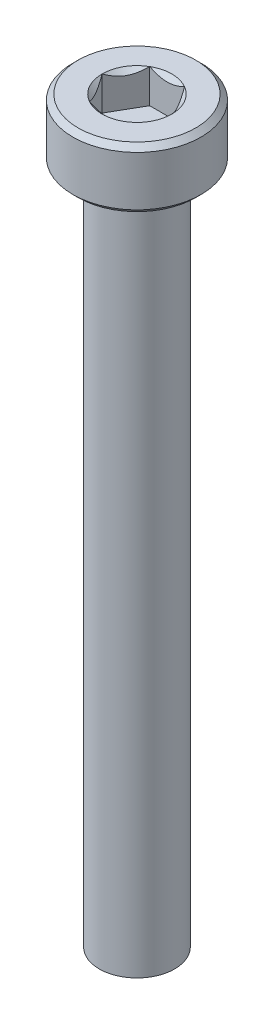
ISO-10303-21;
HEADER;
FILE_DESCRIPTION(('STEP AP214'),'2;1');
FILE_NAME('part.step','',(''),(''),'','','');
FILE_SCHEMA(('AUTOMOTIVE_DESIGN { 1 0 10303 214 1 1 1 1 }'));
ENDSEC;
DATA;
#1=APPLICATION_CONTEXT('core data for automotive mechanical design processes');
#2=APPLICATION_PROTOCOL_DEFINITION('international standard','automotive_design',2000,#1);
#3=PRODUCT_CONTEXT('',#1,'mechanical');
#4=PRODUCT('Part','Part','',(#3));
#5=PRODUCT_RELATED_PRODUCT_CATEGORY('part','',(#4));
#6=PRODUCT_DEFINITION_FORMATION('','',#4);
#7=PRODUCT_DEFINITION_CONTEXT('part definition',#1,'design');
#8=PRODUCT_DEFINITION('design','',#6,#7);
#9=PRODUCT_DEFINITION_SHAPE('','',#8);
#10=(LENGTH_UNIT() NAMED_UNIT(*) SI_UNIT(.MILLI.,.METRE.));
#11=(NAMED_UNIT(*) PLANE_ANGLE_UNIT() SI_UNIT($,.RADIAN.));
#12=(NAMED_UNIT(*) SI_UNIT($,.STERADIAN.) SOLID_ANGLE_UNIT());
#13=UNCERTAINTY_MEASURE_WITH_UNIT(LENGTH_MEASURE(1.E-05),#10,'distance_accuracy_value','');
#14=(GEOMETRIC_REPRESENTATION_CONTEXT(3) GLOBAL_UNCERTAINTY_ASSIGNED_CONTEXT((#13)) GLOBAL_UNIT_ASSIGNED_CONTEXT((#10,
#11,#12)) REPRESENTATION_CONTEXT('',''));
#15=CARTESIAN_POINT('',(0.,0.,0.));
#16=DIRECTION('',(0.,0.,1.));
#17=DIRECTION('',(1.,0.,0.));
#18=AXIS2_PLACEMENT_3D('',#15,#16,#17);
#19=CARTESIAN_POINT('',(0.,4.,0.));
#20=DIRECTION('',(0.,-1.,0.));
#21=DIRECTION('',(0.,0.,-1.));
#22=AXIS2_PLACEMENT_3D('',#19,#20,#21);
#23=CYLINDRICAL_SURFACE('',#22,4.25);
#24=CARTESIAN_POINT('',(0.,0.35,0.));
#25=DIRECTION('',(0.,1.,0.));
#26=DIRECTION('',(0.,0.,1.));
#27=AXIS2_PLACEMENT_3D('',#24,#25,#26);
#28=CIRCLE('',#27,4.25);
#29=CARTESIAN_POINT('',(0.,0.35,4.25));
#30=VERTEX_POINT('',#29);
#31=EDGE_CURVE('E191',#30,#30,#28,.T.);
#32=ORIENTED_EDGE('',*,*,#31,.T.);
#33=EDGE_LOOP('',(#32));
#34=FACE_BOUND('',#33,.T.);
#35=CARTESIAN_POINT('',(0.,3.65,0.));
#36=DIRECTION('',(0.,1.,0.));
#37=DIRECTION('',(0.,0.,1.));
#38=AXIS2_PLACEMENT_3D('',#35,#36,#37);
#39=CIRCLE('',#38,4.25);
#40=CARTESIAN_POINT('',(0.,3.65,4.25));
#41=VERTEX_POINT('',#40);
#42=EDGE_CURVE('E172',#41,#41,#39,.F.);
#43=ORIENTED_EDGE('',*,*,#42,.T.);
#44=EDGE_LOOP('',(#43));
#45=FACE_BOUND('',#44,.T.);
#46=ADVANCED_FACE('F33',(#34,#45),#23,.T.);
#47=CARTESIAN_POINT('',(0.,4.,0.));
#48=DIRECTION('',(0.,1.,0.));
#49=DIRECTION('',(0.,0.,1.));
#50=AXIS2_PLACEMENT_3D('',#47,#48,#49);
#51=PLANE('',#50);
#52=CARTESIAN_POINT('',(0.,4.,0.));
#53=DIRECTION('',(0.,1.,0.));
#54=DIRECTION('',(0.,0.,1.));
#55=AXIS2_PLACEMENT_3D('',#52,#53,#54);
#56=CIRCLE('',#55,3.9);
#57=CARTESIAN_POINT('',(0.,4.,3.9));
#58=VERTEX_POINT('',#57);
#59=EDGE_CURVE('E37',#58,#58,#56,.T.);
#60=ORIENTED_EDGE('',*,*,#59,.T.);
#61=EDGE_LOOP('',(#60));
#62=FACE_BOUND('',#61,.T.);
#63=CARTESIAN_POINT('',(0.,4.,0.));
#64=DIRECTION('',(0.,1.,0.));
#65=DIRECTION('',(0.,0.,1.));
#66=AXIS2_PLACEMENT_3D('',#63,#64,#65);
#67=CIRCLE('',#66,2.3094010767585);
#68=CARTESIAN_POINT('',(1.15470053837925,4.,2.));
#69=VERTEX_POINT('',#68);
#70=CARTESIAN_POINT('',(2.3094010767585,4.,0.));
#71=VERTEX_POINT('',#70);
#72=EDGE_CURVE('E48',#69,#71,#67,.T.);
#73=ORIENTED_EDGE('',*,*,#72,.F.);
#74=CARTESIAN_POINT('',(-1.15470053837925,4.,2.));
#75=VERTEX_POINT('',#74);
#76=EDGE_CURVE('E55',#75,#69,#67,.T.);
#77=ORIENTED_EDGE('',*,*,#76,.F.);
#78=CARTESIAN_POINT('',(-2.3094010767585,4.,0.));
#79=VERTEX_POINT('',#78);
#80=EDGE_CURVE('E220',#79,#75,#67,.T.);
#81=ORIENTED_EDGE('',*,*,#80,.F.);
#82=CARTESIAN_POINT('',(-1.15470053837925,4.,-2.));
#83=VERTEX_POINT('',#82);
#84=EDGE_CURVE('E270',#83,#79,#67,.T.);
#85=ORIENTED_EDGE('',*,*,#84,.F.);
#86=CARTESIAN_POINT('',(1.15470053837925,4.,-2.));
#87=VERTEX_POINT('',#86);
#88=EDGE_CURVE('E274',#87,#83,#67,.T.);
#89=ORIENTED_EDGE('',*,*,#88,.F.);
#90=EDGE_CURVE('E223',#71,#87,#67,.T.);
#91=ORIENTED_EDGE('',*,*,#90,.F.);
#92=EDGE_LOOP('',(#73,#77,#81,#85,#89,#91));
#93=FACE_BOUND('',#92,.T.);
#94=ADVANCED_FACE('F118',(#62,#93),#51,.T.);
#95=CARTESIAN_POINT('',(0.,0.,0.));
#96=DIRECTION('',(0.,1.,0.));
#97=DIRECTION('',(0.,0.,1.));
#98=AXIS2_PLACEMENT_3D('',#95,#96,#97);
#99=PLANE('',#98);
#100=CARTESIAN_POINT('',(0.,0.,0.));
#101=DIRECTION('',(0.,-1.,0.));
#102=DIRECTION('',(0.,0.,-1.));
#103=AXIS2_PLACEMENT_3D('',#100,#101,#102);
#104=CIRCLE('',#103,2.5);
#105=CARTESIAN_POINT('',(0.,0.,2.5));
#106=VERTEX_POINT('',#105);
#107=EDGE_CURVE('E11',#106,#106,#104,.T.);
#108=ORIENTED_EDGE('',*,*,#107,.F.);
#109=EDGE_LOOP('',(#108));
#110=FACE_BOUND('',#109,.T.);
#111=CARTESIAN_POINT('',(0.,0.,0.));
#112=DIRECTION('',(0.,1.,0.));
#113=DIRECTION('',(0.,0.,1.));
#114=AXIS2_PLACEMENT_3D('',#111,#112,#113);
#115=CIRCLE('',#114,3.9);
#116=CARTESIAN_POINT('',(0.,0.,3.9));
#117=VERTEX_POINT('',#116);
#118=EDGE_CURVE('E192',#117,#117,#115,.F.);
#119=ORIENTED_EDGE('',*,*,#118,.T.);
#120=EDGE_LOOP('',(#119));
#121=FACE_BOUND('',#120,.T.);
#122=ADVANCED_FACE('F115',(#110,#121),#99,.F.);
#123=CARTESIAN_POINT('',(0.,4.,0.));
#124=DIRECTION('',(0.,1.,0.));
#125=DIRECTION('',(0.,0.,1.));
#126=AXIS2_PLACEMENT_3D('',#123,#124,#125);
#127=CONICAL_SURFACE('',#126,2.3094010767585,0.78539816339745);
#128=ORIENTED_EDGE('',*,*,#88,.T.);
#129=CARTESIAN_POINT('',(-2.30879514519547,4.7451913710941,-2.));
#130=CARTESIAN_POINT('',(-2.25260483420644,4.70272936243434,-2.));
#131=CARTESIAN_POINT('',(-2.19610054826954,4.66067688200341,-2.));
#132=CARTESIAN_POINT('',(-2.08233997644141,4.57757255324399,-2.));
#133=CARTESIAN_POINT('',(-2.02508350593089,4.53652095791472,-2.));
#134=CARTESIAN_POINT('',(-1.90927566541922,4.45530804643438,-2.));
#135=CARTESIAN_POINT('',(-1.85071770008489,4.41515609122241,-2.));
#136=CARTESIAN_POINT('',(-1.73260864093249,4.3363515847231,-2.));
#137=CARTESIAN_POINT('',(-1.67305761759535,4.29769892766731,-2.));
#138=CARTESIAN_POINT('',(-1.48577916730299,4.18010979954426,-2.));
#139=CARTESIAN_POINT('',(-1.35605368916015,4.10429897318513,-2.));
#140=CARTESIAN_POINT('',(-1.09012591699501,3.96558678933234,-2.));
#141=CARTESIAN_POINT('',(-0.953947448051695,3.90264190405374,-2.));
#142=CARTESIAN_POINT('',(-0.749595808101582,3.82563304479576,-2.));
#143=CARTESIAN_POINT('',(-0.68446185868507,3.80354078810321,-2.));
#144=CARTESIAN_POINT('',(-0.552616590705859,3.76458470124845,-2.));
#145=CARTESIAN_POINT('',(-0.485905164307167,3.74772122964342,-2.));
#146=CARTESIAN_POINT('',(-0.35242076182913,3.72038115809599,-2.));
#147=CARTESIAN_POINT('',(-0.285670630070522,3.70979477255778,-2.));
#148=CARTESIAN_POINT('',(-0.151450075115658,3.69521650264193,-2.));
#149=CARTESIAN_POINT('',(-0.0839797791079536,3.69122347258728,-2.));
#150=CARTESIAN_POINT('',(0.0485458836876959,3.69013056832569,-2.));
#151=CARTESIAN_POINT('',(0.113599297040325,3.69278385991794,-2.));
#152=CARTESIAN_POINT('',(0.243151501456514,3.7042913666304,-2.));
#153=CARTESIAN_POINT('',(0.307650238204749,3.71314618217543,-2.));
#154=CARTESIAN_POINT('',(0.436718068720302,3.73672255220297,-2.));
#155=CARTESIAN_POINT('',(0.501268607918767,3.75154414683371,-2.));
#156=CARTESIAN_POINT('',(0.62895874241765,3.78626456197787,-2.));
#157=CARTESIAN_POINT('',(0.692098453289582,3.80616296494129,-2.));
#158=CARTESIAN_POINT('',(0.890618825033236,3.87621951925558,-2.));
#159=CARTESIAN_POINT('',(1.02317938217928,3.9343452676672,-2.));
#160=CARTESIAN_POINT('',(1.28208571706617,4.06358808493712,-2.));
#161=CARTESIAN_POINT('',(1.40840705860453,4.1347517736225,-2.));
#162=CARTESIAN_POINT('',(1.59098608025607,4.245808104349,-2.));
#163=CARTESIAN_POINT('',(1.64922192266561,4.28251192905768,-2.));
#164=CARTESIAN_POINT('',(1.76469412690495,4.35747121364132,-2.));
#165=CARTESIAN_POINT('',(1.82193041260228,4.39572679097645,-2.));
#166=CARTESIAN_POINT('',(1.93507003138205,4.47318936346553,-2.));
#167=CARTESIAN_POINT('',(1.99098041312104,4.51238611495078,-2.));
#168=CARTESIAN_POINT('',(2.10203689890268,4.59181712257718,-2.));
#169=CARTESIAN_POINT('',(2.15718320893172,4.63205109038507,-2.));
#170=CARTESIAN_POINT('',(2.21200957179853,4.67270997847205,-2.));
#171=B_SPLINE_CURVE_WITH_KNOTS('',3,(#129,#130,#131,#132,#133,#134,#135,#136,#137,#138,#139,
#140,#141,#142,#143,#144,#145,#146,#147,#148,#149,#150,#151,#152,#153,#154,#155,#156,#157,#158,
#159,#160,#161,#162,#163,#164,#165,#166,#167,#168,#169,#170),.UNSPECIFIED.,.F.,.F.,(4,2,2,2,2,2,
2,2,2,2,2,2,2,2,2,2,2,2,2,2,4),(0.,0.211292968403538,0.422638804079875,0.635621962722851,
0.848590068976733,1.29896262331491,1.74778530247796,1.95394639565666,2.16012162294077,
2.36257550428405,2.56499420305935,2.76000764023076,2.95503996100237,3.15348829581996,
3.35192031420439,3.78488584147103,4.2194308621905,4.42592352930545,4.63243185619172,
4.83726388732872,5.04203957897375),.UNSPECIFIED.);
#172=EDGE_CURVE('E188',#87,#83,#171,.F.);
#173=ORIENTED_EDGE('',*,*,#172,.F.);
#174=EDGE_LOOP('',(#128,#173));
#175=FACE_BOUND('',#174,.T.);
#176=ADVANCED_FACE('F96',(#175),#127,.F.);
#177=ORIENTED_EDGE('',*,*,#84,.T.);
#178=CARTESIAN_POINT('',(-1.15458506832541,4.00011547871366,-2.0002));
#179=CARTESIAN_POINT('',(-1.19427965103065,3.96045309022559,-1.93144696596929));
#180=CARTESIAN_POINT('',(-1.23463799837204,3.92311998228416,-1.86154425786449));
#181=CARTESIAN_POINT('',(-1.31693321846145,3.85476368513614,-1.71900475544956));
#182=CARTESIAN_POINT('',(-1.35887791933134,3.82377853373722,-1.64635440243464));
#183=CARTESIAN_POINT('',(-1.44345742638069,3.77070021654414,-1.49985839894603));
#184=CARTESIAN_POINT('',(-1.48607068799507,3.74847362717661,-1.4260500647537));
#185=CARTESIAN_POINT('',(-1.57223542169503,3.71422881667508,-1.27680836816473));
#186=CARTESIAN_POINT('',(-1.61578426088223,3.70218502914413,-1.20137956608185));
#187=CARTESIAN_POINT('',(-1.69083694766536,3.69131851190557,-1.07138449932892));
#188=CARTESIAN_POINT('',(-1.72224381117151,3.68970975360997,-1.01698621602989));
#189=CARTESIAN_POINT('',(-1.78500621460364,3.69241887759871,-0.908278544480304));
#190=CARTESIAN_POINT('',(-1.81636173267754,3.69673883775797,-0.853969194078659));
#191=CARTESIAN_POINT('',(-1.87877671565355,3.71105956740991,-0.74586327241066));
#192=CARTESIAN_POINT('',(-1.90983580972306,3.72106669276201,-0.692067343445206));
#193=CARTESIAN_POINT('',(-1.97141691651548,3.74621243024966,-0.585405737694424));
#194=CARTESIAN_POINT('',(-2.00193897021859,3.76135064904224,-0.532539989929285));
#195=CARTESIAN_POINT('',(-2.08012358375727,3.80629450342919,-0.397120266910154));
#196=CARTESIAN_POINT('',(-2.12730124240478,3.83948883942582,-0.315406165150521));
#197=CARTESIAN_POINT('',(-2.19667172615922,3.89552582317137,-0.195252962742198));
#198=CARTESIAN_POINT('',(-2.21953238052245,3.91521470294694,-0.155657147890823));
#199=CARTESIAN_POINT('',(-2.26483018959123,3.95638731836487,-0.0771990411121286));
#200=CARTESIAN_POINT('',(-2.28726759416161,3.97786995165125,-0.0383363164062609));
#201=CARTESIAN_POINT('',(-2.30951654681234,4.00011547871366,0.000199999999998398));
#202=B_SPLINE_CURVE_WITH_KNOTS('',3,(#178,#179,#180,#181,#182,#183,#184,#185,#186,#187,#188,
#189,#190,#191,#192,#193,#194,#195,#196,#197,#198,#199,#200,#201),.UNSPECIFIED.,.F.,.F.,(4,2,2,
2,2,2,2,2,2,2,2,4),(0.,0.266420613771064,0.534393751523389,0.798110374376916,1.06116288956937,
1.24939906803722,1.43770123566248,1.62621426093932,1.81471283831913,2.11415604834145,
2.2634717071779,2.4126962696977),.UNSPECIFIED.);
#203=EDGE_CURVE('E229',#83,#79,#202,.T.);
#204=ORIENTED_EDGE('',*,*,#203,.F.);
#205=EDGE_LOOP('',(#177,#204));
#206=FACE_BOUND('',#205,.T.);
#207=ADVANCED_FACE('F114',(#206),#127,.F.);
#208=ORIENTED_EDGE('',*,*,#80,.T.);
#209=CARTESIAN_POINT('',(-2.30951654681234,4.00011547871366,-0.000200000000001262));
#210=CARTESIAN_POINT('',(-2.26982196410711,3.96045309022559,0.0685530340307045));
#211=CARTESIAN_POINT('',(-2.22946361676572,3.92311998228416,0.138455742135511));
#212=CARTESIAN_POINT('',(-2.1471683966763,3.85476368513614,0.280995244550435));
#213=CARTESIAN_POINT('',(-2.10522369580642,3.82377853373722,0.353645597565357));
#214=CARTESIAN_POINT('',(-2.02064418875706,3.77070021654414,0.50014160105397));
#215=CARTESIAN_POINT('',(-1.97803092714269,3.74847362717661,0.573949935246294));
#216=CARTESIAN_POINT('',(-1.89186619344273,3.71422881667508,0.723191631835263));
#217=CARTESIAN_POINT('',(-1.84831735425552,3.70218502914413,0.798620433918151));
#218=CARTESIAN_POINT('',(-1.7732646674724,3.69131851190557,0.928615500671078));
#219=CARTESIAN_POINT('',(-1.74185780396625,3.68970975360997,0.983013783970107));
#220=CARTESIAN_POINT('',(-1.67909540053412,3.69241887759871,1.09172145551969));
#221=CARTESIAN_POINT('',(-1.64773988246021,3.69673883775797,1.14603080592134));
#222=CARTESIAN_POINT('',(-1.5853248994842,3.7110595674099,1.25413672758934));
#223=CARTESIAN_POINT('',(-1.55426580541469,3.721066692762,1.30793265655479));
#224=CARTESIAN_POINT('',(-1.49268469862228,3.74621243024966,1.41459426230557));
#225=CARTESIAN_POINT('',(-1.46216264491917,3.76135064904224,1.46746001007071));
#226=CARTESIAN_POINT('',(-1.38397803138049,3.80629450342919,1.60287973308984));
#227=CARTESIAN_POINT('',(-1.33680037273297,3.83948883942582,1.68459383484948));
#228=CARTESIAN_POINT('',(-1.26742988897853,3.89552582317137,1.8047470372578));
#229=CARTESIAN_POINT('',(-1.24456923461531,3.91521470294694,1.84434285210918));
#230=CARTESIAN_POINT('',(-1.19927142554652,3.95638731836487,1.92280095888787));
#231=CARTESIAN_POINT('',(-1.17683402097614,3.97786995165125,1.96166368359374));
#232=CARTESIAN_POINT('',(-1.15458506832541,4.00011547871366,2.0002));
#233=B_SPLINE_CURVE_WITH_KNOTS('',3,(#209,#210,#211,#212,#213,#214,#215,#216,#217,#218,#219,
#220,#221,#222,#223,#224,#225,#226,#227,#228,#229,#230,#231,#232),.UNSPECIFIED.,.F.,.F.,(4,2,2,
2,2,2,2,2,2,2,2,4),(0.,0.266420613771064,0.534393751523389,0.798110374376915,1.06116288956936,
1.24939906803722,1.43770123566247,1.62621426093932,1.81471283831913,2.11415604834145,
2.26347170717791,2.41269626969771),.UNSPECIFIED.);
#234=EDGE_CURVE('E235',#79,#75,#233,.T.);
#235=ORIENTED_EDGE('',*,*,#234,.F.);
#236=EDGE_LOOP('',(#208,#235));
#237=FACE_BOUND('',#236,.T.);
#238=ADVANCED_FACE('F268',(#237),#127,.F.);
#239=ORIENTED_EDGE('',*,*,#76,.T.);
#240=CARTESIAN_POINT('',(-2.30879514519547,4.7451913710941,2.));
#241=CARTESIAN_POINT('',(-2.25260483420644,4.70272936243434,2.));
#242=CARTESIAN_POINT('',(-2.19610054826953,4.66067688200341,2.));
#243=CARTESIAN_POINT('',(-2.0823399764414,4.57757255324399,2.));
#244=CARTESIAN_POINT('',(-2.02508350593089,4.53652095791471,2.));
#245=CARTESIAN_POINT('',(-1.90927566541922,4.45530804643438,2.));
#246=CARTESIAN_POINT('',(-1.85071770008489,4.41515609122241,2.));
#247=CARTESIAN_POINT('',(-1.73260864093249,4.3363515847231,2.));
#248=CARTESIAN_POINT('',(-1.67305761759535,4.29769892766731,2.));
#249=CARTESIAN_POINT('',(-1.48577916730299,4.18010979954426,2.));
#250=CARTESIAN_POINT('',(-1.35605368916015,4.10429897318513,2.));
#251=CARTESIAN_POINT('',(-1.09012591699501,3.96558678933234,2.));
#252=CARTESIAN_POINT('',(-0.953947448051694,3.90264190405374,2.));
#253=CARTESIAN_POINT('',(-0.749595808101582,3.82563304479576,2.));
#254=CARTESIAN_POINT('',(-0.68446185868507,3.80354078810321,2.));
#255=CARTESIAN_POINT('',(-0.552616590705859,3.76458470124845,2.));
#256=CARTESIAN_POINT('',(-0.485905164307167,3.74772122964342,2.));
#257=CARTESIAN_POINT('',(-0.352420761829129,3.72038115809599,2.));
#258=CARTESIAN_POINT('',(-0.285670630070522,3.70979477255778,2.));
#259=CARTESIAN_POINT('',(-0.151450075115657,3.69521650264193,2.));
#260=CARTESIAN_POINT('',(-0.0839797791079529,3.69122347258728,2.));
#261=CARTESIAN_POINT('',(0.0485458836876966,3.69013056832569,2.));
#262=CARTESIAN_POINT('',(0.113599297040325,3.69278385991794,2.));
#263=CARTESIAN_POINT('',(0.243151501456515,3.7042913666304,2.));
#264=CARTESIAN_POINT('',(0.307650238204749,3.71314618217543,2.));
#265=CARTESIAN_POINT('',(0.436718068720302,3.73672255220297,2.));
#266=CARTESIAN_POINT('',(0.501268607918768,3.75154414683371,2.));
#267=CARTESIAN_POINT('',(0.62895874241765,3.78626456197787,2.));
#268=CARTESIAN_POINT('',(0.692098453289583,3.80616296494129,2.));
#269=CARTESIAN_POINT('',(0.890618825033236,3.87621951925558,2.));
#270=CARTESIAN_POINT('',(1.02317938217928,3.9343452676672,2.));
#271=CARTESIAN_POINT('',(1.28208571706617,4.06358808493712,2.));
#272=CARTESIAN_POINT('',(1.40840705860453,4.1347517736225,2.));
#273=CARTESIAN_POINT('',(1.59098608025607,4.24580810434899,2.));
#274=CARTESIAN_POINT('',(1.64922192266561,4.28251192905768,2.));
#275=CARTESIAN_POINT('',(1.76469412690495,4.35747121364132,2.));
#276=CARTESIAN_POINT('',(1.82193041260228,4.39572679097644,2.));
#277=CARTESIAN_POINT('',(1.93507003138205,4.47318936346553,2.));
#278=CARTESIAN_POINT('',(1.99098041312104,4.51238611495078,2.));
#279=CARTESIAN_POINT('',(2.10203689890268,4.59181712257718,2.));
#280=CARTESIAN_POINT('',(2.15718320893172,4.63205109038507,2.));
#281=CARTESIAN_POINT('',(2.21200957179853,4.67270997847205,2.));
#282=B_SPLINE_CURVE_WITH_KNOTS('',3,(#240,#241,#242,#243,#244,#245,#246,#247,#248,#249,#250,
#251,#252,#253,#254,#255,#256,#257,#258,#259,#260,#261,#262,#263,#264,#265,#266,#267,#268,#269,
#270,#271,#272,#273,#274,#275,#276,#277,#278,#279,#280,#281),.UNSPECIFIED.,.F.,.F.,(4,2,2,2,2,2,
2,2,2,2,2,2,2,2,2,2,2,2,2,2,4),(0.,0.211292968403538,0.422638804079876,0.63562196272285,
0.848590068976733,1.29896262331491,1.74778530247796,1.95394639565666,2.16012162294077,
2.36257550428405,2.56499420305935,2.76000764023076,2.95503996100237,3.15348829581996,
3.35192031420438,3.78488584147103,4.2194308621905,4.42592352930545,4.63243185619172,
4.83726388732871,5.04203957897375),.UNSPECIFIED.);
#283=EDGE_CURVE('E254',#75,#69,#282,.T.);
#284=ORIENTED_EDGE('',*,*,#283,.F.);
#285=EDGE_LOOP('',(#239,#284));
#286=FACE_BOUND('',#285,.T.);
#287=ADVANCED_FACE('F267',(#286),#127,.F.);
#288=ORIENTED_EDGE('',*,*,#72,.T.);
#289=CARTESIAN_POINT('',(1.15458506832541,4.00011547871366,2.0002));
#290=CARTESIAN_POINT('',(1.19427965103064,3.96045309022559,1.93144696596929));
#291=CARTESIAN_POINT('',(1.23463799837204,3.92311998228416,1.86154425786449));
#292=CARTESIAN_POINT('',(1.31693321846145,3.85476368513614,1.71900475544956));
#293=CARTESIAN_POINT('',(1.35887791933134,3.82377853373722,1.64635440243464));
#294=CARTESIAN_POINT('',(1.44345742638069,3.77070021654414,1.49985839894603));
#295=CARTESIAN_POINT('',(1.48607068799507,3.74847362717661,1.42605006475371));
#296=CARTESIAN_POINT('',(1.57223542169503,3.71422881667508,1.27680836816474));
#297=CARTESIAN_POINT('',(1.61578426088223,3.70218502914413,1.20137956608185));
#298=CARTESIAN_POINT('',(1.69083694766536,3.69131851190557,1.07138449932892));
#299=CARTESIAN_POINT('',(1.72224381117151,3.68970975360997,1.01698621602989));
#300=CARTESIAN_POINT('',(1.78500621460364,3.69241887759871,0.908278544480306));
#301=CARTESIAN_POINT('',(1.81636173267754,3.69673883775797,0.85396919407866));
#302=CARTESIAN_POINT('',(1.87877671565355,3.71105956740991,0.745863272410661));
#303=CARTESIAN_POINT('',(1.90983580972306,3.72106669276201,0.692067343445207));
#304=CARTESIAN_POINT('',(1.97141691651548,3.74621243024966,0.585405737694425));
#305=CARTESIAN_POINT('',(2.00193897021859,3.76135064904224,0.532539989929286));
#306=CARTESIAN_POINT('',(2.08012358375727,3.80629450342919,0.397120266910155));
#307=CARTESIAN_POINT('',(2.12730124240478,3.83948883942582,0.315406165150521));
#308=CARTESIAN_POINT('',(2.19667172615922,3.89552582317137,0.195252962742197));
#309=CARTESIAN_POINT('',(2.21953238052245,3.91521470294694,0.155657147890823));
#310=CARTESIAN_POINT('',(2.26483018959124,3.95638731836487,0.0771990411121278));
#311=CARTESIAN_POINT('',(2.28726759416161,3.97786995165125,0.0383363164062597));
#312=CARTESIAN_POINT('',(2.30951654681234,4.00011547871366,-0.000200000000000139));
#313=B_SPLINE_CURVE_WITH_KNOTS('',3,(#289,#290,#291,#292,#293,#294,#295,#296,#297,#298,#299,
#300,#301,#302,#303,#304,#305,#306,#307,#308,#309,#310,#311,#312),.UNSPECIFIED.,.F.,.F.,(4,2,2,
2,2,2,2,2,2,2,2,4),(0.,0.266420613771064,0.534393751523389,0.798110374376915,1.06116288956936,
1.24939906803722,1.43770123566248,1.62621426093932,1.81471283831913,2.11415604834145,
2.2634717071779,2.41269626969771),.UNSPECIFIED.);
#314=EDGE_CURVE('E145',#69,#71,#313,.T.);
#315=ORIENTED_EDGE('',*,*,#314,.F.);
#316=EDGE_LOOP('',(#288,#315));
#317=FACE_BOUND('',#316,.T.);
#318=ADVANCED_FACE('F111',(#317),#127,.F.);
#319=ORIENTED_EDGE('',*,*,#90,.T.);
#320=CARTESIAN_POINT('',(2.30951654681234,4.00011547871366,0.000199999999999522));
#321=CARTESIAN_POINT('',(2.26982196410711,3.96045309022559,-0.0685530340307061));
#322=CARTESIAN_POINT('',(2.22946361676572,3.92311998228416,-0.138455742135512));
#323=CARTESIAN_POINT('',(2.1471683966763,3.85476368513614,-0.280995244550437));
#324=CARTESIAN_POINT('',(2.10522369580642,3.82377853373722,-0.353645597565359));
#325=CARTESIAN_POINT('',(2.02064418875706,3.77070021654414,-0.500141601053972));
#326=CARTESIAN_POINT('',(1.97803092714269,3.74847362717661,-0.573949935246295));
#327=CARTESIAN_POINT('',(1.89186619344273,3.71422881667508,-0.723191631835264));
#328=CARTESIAN_POINT('',(1.84831735425552,3.70218502914413,-0.798620433918152));
#329=CARTESIAN_POINT('',(1.7732646674724,3.69131851190557,-0.928615500671079));
#330=CARTESIAN_POINT('',(1.74185780396625,3.68970975360997,-0.983013783970109));
#331=CARTESIAN_POINT('',(1.67909540053412,3.69241887759871,-1.09172145551969));
#332=CARTESIAN_POINT('',(1.64773988246021,3.69673883775797,-1.14603080592134));
#333=CARTESIAN_POINT('',(1.5853248994842,3.71105956740991,-1.25413672758934));
#334=CARTESIAN_POINT('',(1.55426580541469,3.72106669276201,-1.30793265655479));
#335=CARTESIAN_POINT('',(1.49268469862228,3.74621243024966,-1.41459426230557));
#336=CARTESIAN_POINT('',(1.46216264491917,3.76135064904224,-1.46746001007071));
#337=CARTESIAN_POINT('',(1.38397803138049,3.80629450342919,-1.60287973308984));
#338=CARTESIAN_POINT('',(1.33680037273297,3.83948883942582,-1.68459383484948));
#339=CARTESIAN_POINT('',(1.26742988897853,3.89552582317137,-1.8047470372578));
#340=CARTESIAN_POINT('',(1.24456923461531,3.91521470294694,-1.84434285210918));
#341=CARTESIAN_POINT('',(1.19927142554652,3.95638731836487,-1.92280095888787));
#342=CARTESIAN_POINT('',(1.17683402097614,3.97786995165125,-1.96166368359374));
#343=CARTESIAN_POINT('',(1.15458506832541,4.00011547871366,-2.0002));
#344=B_SPLINE_CURVE_WITH_KNOTS('',3,(#320,#321,#322,#323,#324,#325,#326,#327,#328,#329,#330,
#331,#332,#333,#334,#335,#336,#337,#338,#339,#340,#341,#342,#343),.UNSPECIFIED.,.F.,.F.,(4,2,2,
2,2,2,2,2,2,2,2,4),(0.,0.266420613771064,0.534393751523388,0.798110374376914,1.06116288956936,
1.24939906803722,1.43770123566247,1.62621426093932,1.81471283831913,2.11415604834145,
2.2634717071779,2.41269626969771),.UNSPECIFIED.);
#345=EDGE_CURVE('E137',#71,#87,#344,.T.);
#346=ORIENTED_EDGE('',*,*,#345,.F.);
#347=EDGE_LOOP('',(#319,#346));
#348=FACE_BOUND('',#347,.T.);
#349=ADVANCED_FACE('F95',(#348),#127,.F.);
#350=CARTESIAN_POINT('',(0.,1.75,0.));
#351=DIRECTION('',(0.,1.,0.));
#352=DIRECTION('',(0.,0.,1.));
#353=AXIS2_PLACEMENT_3D('',#350,#351,#352);
#354=PLANE('',#353);
#355=CARTESIAN_POINT('',(0.,1.75,0.));
#356=DIRECTION('',(0.,1.,0.));
#357=DIRECTION('',(0.,0.,1.));
#358=AXIS2_PLACEMENT_3D('',#355,#356,#357);
#359=CIRCLE('',#358,0.059401076758495);
#360=CARTESIAN_POINT('',(0.,1.75,0.059401076758495));
#361=VERTEX_POINT('',#360);
#362=EDGE_CURVE('E186',#361,#361,#359,.T.);
#363=ORIENTED_EDGE('',*,*,#362,.F.);
#364=EDGE_LOOP('',(#363));
#365=FACE_BOUND('',#364,.T.);
#366=DIRECTION('',(-0.5,0.,-0.866025403784439));
#367=VECTOR('',#366,1.);
#368=CARTESIAN_POINT('',(2.3094010767585,1.75,0.));
#369=LINE('',#368,#367);
#370=CARTESIAN_POINT('',(2.3094010767585,1.75,0.));
#371=VERTEX_POINT('',#370);
#372=CARTESIAN_POINT('',(1.15470053837925,1.75,-2.));
#373=VERTEX_POINT('',#372);
#374=EDGE_CURVE('E144',#371,#373,#369,.T.);
#375=ORIENTED_EDGE('',*,*,#374,.T.);
#376=DIRECTION('',(-1.,0.,0.));
#377=VECTOR('',#376,1.);
#378=CARTESIAN_POINT('',(1.15470053837925,1.75,-2.));
#379=LINE('',#378,#377);
#380=CARTESIAN_POINT('',(-1.15470053837925,1.75,-2.));
#381=VERTEX_POINT('',#380);
#382=EDGE_CURVE('E153',#373,#381,#379,.T.);
#383=ORIENTED_EDGE('',*,*,#382,.T.);
#384=DIRECTION('',(-0.5,0.,0.866025403784439));
#385=VECTOR('',#384,1.);
#386=CARTESIAN_POINT('',(-1.15470053837925,1.75,-2.));
#387=LINE('',#386,#385);
#388=CARTESIAN_POINT('',(-2.3094010767585,1.75,0.));
#389=VERTEX_POINT('',#388);
#390=EDGE_CURVE('E156',#381,#389,#387,.T.);
#391=ORIENTED_EDGE('',*,*,#390,.T.);
#392=DIRECTION('',(0.5,0.,0.866025403784439));
#393=VECTOR('',#392,1.);
#394=CARTESIAN_POINT('',(-2.3094010767585,1.75,0.));
#395=LINE('',#394,#393);
#396=CARTESIAN_POINT('',(-1.15470053837925,1.75,2.));
#397=VERTEX_POINT('',#396);
#398=EDGE_CURVE('E159',#389,#397,#395,.T.);
#399=ORIENTED_EDGE('',*,*,#398,.T.);
#400=DIRECTION('',(1.,0.,0.));
#401=VECTOR('',#400,1.);
#402=CARTESIAN_POINT('',(-1.15470053837925,1.75,2.));
#403=LINE('',#402,#401);
#404=CARTESIAN_POINT('',(1.15470053837925,1.75,2.));
#405=VERTEX_POINT('',#404);
#406=EDGE_CURVE('E162',#397,#405,#403,.T.);
#407=ORIENTED_EDGE('',*,*,#406,.T.);
#408=DIRECTION('',(0.5,0.,-0.866025403784439));
#409=VECTOR('',#408,1.);
#410=CARTESIAN_POINT('',(1.15470053837925,1.75,2.));
#411=LINE('',#410,#409);
#412=EDGE_CURVE('E165',#405,#371,#411,.T.);
#413=ORIENTED_EDGE('',*,*,#412,.T.);
#414=EDGE_LOOP('',(#375,#383,#391,#399,#407,#413));
#415=FACE_BOUND('',#414,.T.);
#416=ADVANCED_FACE('F110',(#365,#415),#354,.T.);
#417=CARTESIAN_POINT('',(1.15470053837925,1.75,-2.));
#418=DIRECTION('',(0.,0.,-1.));
#419=DIRECTION('',(-1.,0.,0.));
#420=AXIS2_PLACEMENT_3D('',#417,#418,#419);
#421=PLANE('',#420);
#422=DIRECTION('',(0.,1.,0.));
#423=VECTOR('',#422,1.);
#424=CARTESIAN_POINT('',(1.15470053837925,1.75,-2.));
#425=LINE('',#424,#423);
#426=EDGE_CURVE('E168',#373,#87,#425,.T.);
#427=ORIENTED_EDGE('',*,*,#426,.T.);
#428=ORIENTED_EDGE('',*,*,#172,.T.);
#429=DIRECTION('',(0.,1.,0.));
#430=VECTOR('',#429,1.);
#431=CARTESIAN_POINT('',(-1.15470053837925,1.75,-2.));
#432=LINE('',#431,#430);
#433=EDGE_CURVE('E181',#381,#83,#432,.T.);
#434=ORIENTED_EDGE('',*,*,#433,.F.);
#435=ORIENTED_EDGE('',*,*,#382,.F.);
#436=EDGE_LOOP('',(#427,#428,#434,#435));
#437=FACE_BOUND('',#436,.T.);
#438=ADVANCED_FACE('F133',(#437),#421,.F.);
#439=CARTESIAN_POINT('',(-1.15470053837925,1.75,-2.));
#440=DIRECTION('',(-0.866025403784439,0.,-0.5));
#441=DIRECTION('',(-0.5,0.,0.866025403784439));
#442=AXIS2_PLACEMENT_3D('',#439,#440,#441);
#443=PLANE('',#442);
#444=ORIENTED_EDGE('',*,*,#433,.T.);
#445=ORIENTED_EDGE('',*,*,#203,.T.);
#446=DIRECTION('',(0.,1.,0.));
#447=VECTOR('',#446,1.);
#448=CARTESIAN_POINT('',(-2.3094010767585,1.75,0.));
#449=LINE('',#448,#447);
#450=EDGE_CURVE('E178',#389,#79,#449,.T.);
#451=ORIENTED_EDGE('',*,*,#450,.F.);
#452=ORIENTED_EDGE('',*,*,#390,.F.);
#453=EDGE_LOOP('',(#444,#445,#451,#452));
#454=FACE_BOUND('',#453,.T.);
#455=ADVANCED_FACE('F240',(#454),#443,.F.);
#456=CARTESIAN_POINT('',(-2.3094010767585,1.75,0.));
#457=DIRECTION('',(-0.866025403784439,0.,0.5));
#458=DIRECTION('',(0.5,0.,0.866025403784439));
#459=AXIS2_PLACEMENT_3D('',#456,#457,#458);
#460=PLANE('',#459);
#461=ORIENTED_EDGE('',*,*,#450,.T.);
#462=ORIENTED_EDGE('',*,*,#234,.T.);
#463=DIRECTION('',(0.,1.,0.));
#464=VECTOR('',#463,1.);
#465=CARTESIAN_POINT('',(-1.15470053837925,1.75,2.));
#466=LINE('',#465,#464);
#467=EDGE_CURVE('E176',#397,#75,#466,.T.);
#468=ORIENTED_EDGE('',*,*,#467,.F.);
#469=ORIENTED_EDGE('',*,*,#398,.F.);
#470=EDGE_LOOP('',(#461,#462,#468,#469));
#471=FACE_BOUND('',#470,.T.);
#472=ADVANCED_FACE('F243',(#471),#460,.F.);
#473=CARTESIAN_POINT('',(-1.15470053837925,1.75,2.));
#474=DIRECTION('',(0.,0.,1.));
#475=DIRECTION('',(1.,0.,0.));
#476=AXIS2_PLACEMENT_3D('',#473,#474,#475);
#477=PLANE('',#476);
#478=ORIENTED_EDGE('',*,*,#467,.T.);
#479=ORIENTED_EDGE('',*,*,#283,.T.);
#480=DIRECTION('',(0.,1.,0.));
#481=VECTOR('',#480,1.);
#482=CARTESIAN_POINT('',(1.15470053837925,1.75,2.));
#483=LINE('',#482,#481);
#484=EDGE_CURVE('E173',#405,#69,#483,.T.);
#485=ORIENTED_EDGE('',*,*,#484,.F.);
#486=ORIENTED_EDGE('',*,*,#406,.F.);
#487=EDGE_LOOP('',(#478,#479,#485,#486));
#488=FACE_BOUND('',#487,.T.);
#489=ADVANCED_FACE('F248',(#488),#477,.F.);
#490=CARTESIAN_POINT('',(1.15470053837925,1.75,2.));
#491=DIRECTION('',(0.866025403784439,0.,0.5));
#492=DIRECTION('',(0.5,0.,-0.866025403784439));
#493=AXIS2_PLACEMENT_3D('',#490,#491,#492);
#494=PLANE('',#493);
#495=ORIENTED_EDGE('',*,*,#484,.T.);
#496=ORIENTED_EDGE('',*,*,#314,.T.);
#497=DIRECTION('',(0.,1.,0.));
#498=VECTOR('',#497,1.);
#499=CARTESIAN_POINT('',(2.3094010767585,1.75,0.));
#500=LINE('',#499,#498);
#501=EDGE_CURVE('E169',#371,#71,#500,.T.);
#502=ORIENTED_EDGE('',*,*,#501,.F.);
#503=ORIENTED_EDGE('',*,*,#412,.F.);
#504=EDGE_LOOP('',(#495,#496,#502,#503));
#505=FACE_BOUND('',#504,.T.);
#506=ADVANCED_FACE('F102',(#505),#494,.F.);
#507=CARTESIAN_POINT('',(2.3094010767585,1.75,0.));
#508=DIRECTION('',(0.866025403784439,0.,-0.5));
#509=DIRECTION('',(-0.5,0.,-0.866025403784439));
#510=AXIS2_PLACEMENT_3D('',#507,#508,#509);
#511=PLANE('',#510);
#512=ORIENTED_EDGE('',*,*,#501,.T.);
#513=ORIENTED_EDGE('',*,*,#345,.T.);
#514=ORIENTED_EDGE('',*,*,#426,.F.);
#515=ORIENTED_EDGE('',*,*,#374,.F.);
#516=EDGE_LOOP('',(#512,#513,#514,#515));
#517=FACE_BOUND('',#516,.T.);
#518=ADVANCED_FACE('F92',(#517),#511,.F.);
#519=ORIENTED_EDGE('',*,*,#362,.T.);
#520=EDGE_LOOP('',(#519));
#521=FACE_BOUND('',#520,.T.);
#522=CARTESIAN_POINT('',(0.,1.69059892324151,0.));
#523=VERTEX_POINT('',#522);
#524=VERTEX_LOOP('',#523);
#525=FACE_BOUND('',#524,.T.);
#526=ADVANCED_FACE('F89',(#521,#525),#127,.F.);
#527=CARTESIAN_POINT('',(0.,0.35,0.));
#528=DIRECTION('',(0.,1.,0.));
#529=DIRECTION('',(0.,0.,1.));
#530=AXIS2_PLACEMENT_3D('',#527,#528,#529);
#531=CONICAL_SURFACE('',#530,4.25,0.78539816339745);
#532=CARTESIAN_POINT('',(0.,0.,3.9));
#533=CARTESIAN_POINT('',(0.,0.00364583333333348,3.90364583333333));
#534=CARTESIAN_POINT('',(0.,0.00729166666666674,3.90729166666667));
#535=CARTESIAN_POINT('',(0.,0.0145833333333333,3.91458333333333));
#536=CARTESIAN_POINT('',(0.,0.0182291666666665,3.91822916666667));
#537=CARTESIAN_POINT('',(0.,0.0255208333333332,3.92552083333333));
#538=CARTESIAN_POINT('',(0.,0.0291666666666665,3.92916666666667));
#539=CARTESIAN_POINT('',(0.,0.0364583333333333,3.93645833333333));
#540=CARTESIAN_POINT('',(0.,0.0401041666666667,3.94010416666667));
#541=CARTESIAN_POINT('',(0.,0.0473958333333333,3.94739583333333));
#542=CARTESIAN_POINT('',(0.,0.0510416666666665,3.95104166666667));
#543=CARTESIAN_POINT('',(0.,0.0583333333333331,3.95833333333333));
#544=CARTESIAN_POINT('',(0.,0.0619791666666666,3.96197916666667));
#545=CARTESIAN_POINT('',(0.,0.0692708333333333,3.96927083333333));
#546=CARTESIAN_POINT('',(0.,0.0729166666666665,3.97291666666667));
#547=CARTESIAN_POINT('',(0.,0.0802083333333331,3.98020833333333));
#548=CARTESIAN_POINT('',(0.,0.0838541666666666,3.98385416666667));
#549=CARTESIAN_POINT('',(0.,0.0911458333333333,3.99114583333333));
#550=CARTESIAN_POINT('',(0.,0.0947916666666665,3.99479166666667));
#551=CARTESIAN_POINT('',(0.,0.102083333333333,4.00208333333333));
#552=CARTESIAN_POINT('',(0.,0.105729166666666,4.00572916666667));
#553=CARTESIAN_POINT('',(0.,0.113020833333333,4.01302083333333));
#554=CARTESIAN_POINT('',(0.,0.116666666666667,4.01666666666667));
#555=CARTESIAN_POINT('',(0.,0.123958333333333,4.02395833333333));
#556=CARTESIAN_POINT('',(0.,0.127604166666666,4.02760416666667));
#557=CARTESIAN_POINT('',(0.,0.134895833333333,4.03489583333333));
#558=CARTESIAN_POINT('',(0.,0.138541666666667,4.03854166666667));
#559=CARTESIAN_POINT('',(0.,0.145833333333333,4.04583333333333));
#560=CARTESIAN_POINT('',(0.,0.149479166666666,4.04947916666667));
#561=CARTESIAN_POINT('',(0.,0.156770833333333,4.05677083333333));
#562=CARTESIAN_POINT('',(0.,0.160416666666666,4.06041666666667));
#563=CARTESIAN_POINT('',(0.,0.167708333333333,4.06770833333333));
#564=CARTESIAN_POINT('',(0.,0.171354166666667,4.07135416666667));
#565=CARTESIAN_POINT('',(0.,0.178645833333333,4.07864583333333));
#566=CARTESIAN_POINT('',(0.,0.182291666666666,4.08229166666667));
#567=CARTESIAN_POINT('',(0.,0.189583333333333,4.08958333333333));
#568=CARTESIAN_POINT('',(0.,0.193229166666666,4.09322916666667));
#569=CARTESIAN_POINT('',(0.,0.200520833333333,4.10052083333333));
#570=CARTESIAN_POINT('',(0.,0.204166666666666,4.10416666666667));
#571=CARTESIAN_POINT('',(0.,0.211458333333333,4.11145833333333));
#572=CARTESIAN_POINT('',(0.,0.215104166666666,4.11510416666667));
#573=CARTESIAN_POINT('',(0.,0.222395833333333,4.12239583333333));
#574=CARTESIAN_POINT('',(0.,0.226041666666666,4.12604166666667));
#575=CARTESIAN_POINT('',(0.,0.233333333333333,4.13333333333333));
#576=CARTESIAN_POINT('',(0.,0.236979166666666,4.13697916666667));
#577=CARTESIAN_POINT('',(0.,0.244270833333333,4.14427083333333));
#578=CARTESIAN_POINT('',(0.,0.247916666666666,4.14791666666667));
#579=CARTESIAN_POINT('',(0.,0.255208333333333,4.15520833333333));
#580=CARTESIAN_POINT('',(0.,0.258854166666666,4.15885416666667));
#581=CARTESIAN_POINT('',(0.,0.266145833333333,4.16614583333333));
#582=CARTESIAN_POINT('',(0.,0.269791666666666,4.16979166666667));
#583=CARTESIAN_POINT('',(0.,0.277083333333333,4.17708333333333));
#584=CARTESIAN_POINT('',(0.,0.280729166666666,4.18072916666667));
#585=CARTESIAN_POINT('',(0.,0.288020833333333,4.18802083333333));
#586=CARTESIAN_POINT('',(0.,0.291666666666666,4.19166666666667));
#587=CARTESIAN_POINT('',(0.,0.298958333333333,4.19895833333333));
#588=CARTESIAN_POINT('',(0.,0.302604166666666,4.20260416666667));
#589=CARTESIAN_POINT('',(0.,0.309895833333333,4.20989583333333));
#590=CARTESIAN_POINT('',(0.,0.313541666666666,4.21354166666667));
#591=CARTESIAN_POINT('',(0.,0.320833333333333,4.22083333333333));
#592=CARTESIAN_POINT('',(0.,0.324479166666666,4.22447916666667));
#593=CARTESIAN_POINT('',(0.,0.331770833333333,4.23177083333333));
#594=CARTESIAN_POINT('',(0.,0.335416666666666,4.23541666666667));
#595=CARTESIAN_POINT('',(0.,0.342708333333333,4.24270833333333));
#596=CARTESIAN_POINT('',(0.,0.346354166666666,4.24635416666667));
#597=CARTESIAN_POINT('',(0.,0.35,4.25));
#598=B_SPLINE_CURVE_WITH_KNOTS('',3,(#532,#533,#534,#535,#536,#537,#538,#539,#540,#541,#542,
#543,#544,#545,#546,#547,#548,#549,#550,#551,#552,#553,#554,#555,#556,#557,#558,#559,#560,#561,
#562,#563,#564,#565,#566,#567,#568,#569,#570,#571,#572,#573,#574,#575,#576,#577,#578,#579,#580,
#581,#582,#583,#584,#585,#586,#587,#588,#589,#590,#591,#592,#593,#594,#595,#596,#597),
.UNSPECIFIED.,.F.,.F.,(4,2,2,2,2,2,2,2,2,2,2,2,2,2,2,2,2,2,2,2,2,2,2,2,2,2,2,2,2,2,2,2,4),(0.,
0.0154679608384555,0.0309359216769116,0.0464038825153671,0.0618718433538225,0.0773398041922786,
0.0928077650307341,0.10827572586919,0.123743686707646,0.139211647546102,0.154679608384557,
0.170147569223013,0.185615530061469,0.201083490899924,0.21655145173838,0.232019412576836,
0.247487373415291,0.262955334253747,0.278423295092203,0.293891255930659,0.309359216769114,
0.32482717760757,0.340295138446026,0.355763099284482,0.371231060122938,0.386699020961393,
0.402166981799849,0.417634942638305,0.43310290347676,0.448570864315216,0.464038825153672,
0.479506785992128,0.494974746830583),.UNSPECIFIED.);
#599=EDGE_CURVE('BSEAM91',#117,#30,#598,.T.);
#600=ORIENTED_EDGE('',*,*,#118,.F.);
#601=ORIENTED_EDGE('',*,*,#31,.F.);
#602=ORIENTED_EDGE('',*,*,#599,.T.);
#603=ORIENTED_EDGE('',*,*,#599,.F.);
#604=EDGE_LOOP('',(#600,#602,#601,#603));
#605=FACE_BOUND('',#604,.T.);
#606=ADVANCED_FACE('F91',(#605),#531,.T.);
#607=CARTESIAN_POINT('',(0.,4.,0.));
#608=DIRECTION('',(0.,-1.,0.));
#609=DIRECTION('',(0.,0.,-1.));
#610=AXIS2_PLACEMENT_3D('',#607,#608,#609);
#611=CONICAL_SURFACE('',#610,3.9,0.785398163397448);
#612=ORIENTED_EDGE('',*,*,#42,.F.);
#613=EDGE_LOOP('',(#612));
#614=FACE_BOUND('',#613,.T.);
#615=ORIENTED_EDGE('',*,*,#59,.F.);
#616=EDGE_LOOP('',(#615));
#617=FACE_BOUND('',#616,.T.);
#618=ADVANCED_FACE('F35',(#614,#617),#611,.T.);
#619=CARTESIAN_POINT('',(0.,-45.,0.));
#620=DIRECTION('',(0.,1.,0.));
#621=DIRECTION('',(0.,0.,1.));
#622=AXIS2_PLACEMENT_3D('',#619,#620,#621);
#623=CYLINDRICAL_SURFACE('',#622,2.5);
#624=CARTESIAN_POINT('',(0.,-45.,0.));
#625=DIRECTION('',(0.,-1.,0.));
#626=DIRECTION('',(0.,0.,-1.));
#627=AXIS2_PLACEMENT_3D('',#624,#625,#626);
#628=CIRCLE('',#627,2.5);
#629=CARTESIAN_POINT('',(0.,-45.,2.5));
#630=VERTEX_POINT('',#629);
#631=EDGE_CURVE('E217',#630,#630,#628,.T.);
#632=CARTESIAN_POINT('',(0.,-45.,2.5));
#633=CARTESIAN_POINT('',(0.,-44.53125,2.5));
#634=CARTESIAN_POINT('',(0.,-44.0625,2.5));
#635=CARTESIAN_POINT('',(0.,-43.125,2.5));
#636=CARTESIAN_POINT('',(0.,-42.65625,2.5));
#637=CARTESIAN_POINT('',(0.,-41.71875,2.5));
#638=CARTESIAN_POINT('',(0.,-41.25,2.5));
#639=CARTESIAN_POINT('',(0.,-40.3125,2.5));
#640=CARTESIAN_POINT('',(0.,-39.84375,2.5));
#641=CARTESIAN_POINT('',(0.,-38.90625,2.5));
#642=CARTESIAN_POINT('',(0.,-38.4375,2.5));
#643=CARTESIAN_POINT('',(0.,-37.5,2.5));
#644=CARTESIAN_POINT('',(0.,-37.03125,2.5));
#645=CARTESIAN_POINT('',(0.,-36.09375,2.5));
#646=CARTESIAN_POINT('',(0.,-35.625,2.5));
#647=CARTESIAN_POINT('',(0.,-34.6875,2.5));
#648=CARTESIAN_POINT('',(0.,-34.21875,2.5));
#649=CARTESIAN_POINT('',(0.,-33.28125,2.5));
#650=CARTESIAN_POINT('',(0.,-32.8125,2.5));
#651=CARTESIAN_POINT('',(0.,-31.875,2.5));
#652=CARTESIAN_POINT('',(0.,-31.40625,2.5));
#653=CARTESIAN_POINT('',(0.,-30.46875,2.5));
#654=CARTESIAN_POINT('',(0.,-30.,2.5));
#655=CARTESIAN_POINT('',(0.,-29.0625,2.5));
#656=CARTESIAN_POINT('',(0.,-28.59375,2.5));
#657=CARTESIAN_POINT('',(0.,-27.65625,2.5));
#658=CARTESIAN_POINT('',(0.,-27.1875,2.5));
#659=CARTESIAN_POINT('',(0.,-26.25,2.5));
#660=CARTESIAN_POINT('',(0.,-25.78125,2.5));
#661=CARTESIAN_POINT('',(0.,-24.84375,2.5));
#662=CARTESIAN_POINT('',(0.,-24.375,2.5));
#663=CARTESIAN_POINT('',(0.,-23.4375,2.5));
#664=CARTESIAN_POINT('',(0.,-22.96875,2.5));
#665=CARTESIAN_POINT('',(0.,-22.03125,2.5));
#666=CARTESIAN_POINT('',(0.,-21.5625,2.5));
#667=CARTESIAN_POINT('',(0.,-20.625,2.5));
#668=CARTESIAN_POINT('',(0.,-20.15625,2.5));
#669=CARTESIAN_POINT('',(0.,-19.21875,2.5));
#670=CARTESIAN_POINT('',(0.,-18.75,2.5));
#671=CARTESIAN_POINT('',(0.,-17.8125,2.5));
#672=CARTESIAN_POINT('',(0.,-17.34375,2.5));
#673=CARTESIAN_POINT('',(0.,-16.40625,2.5));
#674=CARTESIAN_POINT('',(0.,-15.9375,2.5));
#675=CARTESIAN_POINT('',(0.,-15.,2.5));
#676=CARTESIAN_POINT('',(0.,-14.53125,2.5));
#677=CARTESIAN_POINT('',(0.,-13.59375,2.5));
#678=CARTESIAN_POINT('',(0.,-13.125,2.5));
#679=CARTESIAN_POINT('',(0.,-12.1875,2.5));
#680=CARTESIAN_POINT('',(0.,-11.71875,2.5));
#681=CARTESIAN_POINT('',(0.,-10.78125,2.5));
#682=CARTESIAN_POINT('',(0.,-10.3125,2.5));
#683=CARTESIAN_POINT('',(0.,-9.37499999999999,2.5));
#684=CARTESIAN_POINT('',(0.,-8.90624999999999,2.5));
#685=CARTESIAN_POINT('',(0.,-7.96874999999999,2.5));
#686=CARTESIAN_POINT('',(0.,-7.5,2.5));
#687=CARTESIAN_POINT('',(0.,-6.56249999999999,2.5));
#688=CARTESIAN_POINT('',(0.,-6.09374999999999,2.5));
#689=CARTESIAN_POINT('',(0.,-5.15624999999999,2.5));
#690=CARTESIAN_POINT('',(0.,-4.68749999999999,2.5));
#691=CARTESIAN_POINT('',(0.,-3.74999999999999,2.5));
#692=CARTESIAN_POINT('',(0.,-3.28124999999999,2.5));
#693=CARTESIAN_POINT('',(0.,-2.34374999999999,2.5));
#694=CARTESIAN_POINT('',(0.,-1.87499999999999,2.5));
#695=CARTESIAN_POINT('',(0.,-0.937499999999992,2.5));
#696=CARTESIAN_POINT('',(0.,-0.468749999999993,2.5));
#697=CARTESIAN_POINT('',(0.,0.,2.5));
#698=B_SPLINE_CURVE_WITH_KNOTS('',3,(#632,#633,#634,#635,#636,#637,#638,#639,#640,#641,#642,
#643,#644,#645,#646,#647,#648,#649,#650,#651,#652,#653,#654,#655,#656,#657,#658,#659,#660,#661,
#662,#663,#664,#665,#666,#667,#668,#669,#670,#671,#672,#673,#674,#675,#676,#677,#678,#679,#680,
#681,#682,#683,#684,#685,#686,#687,#688,#689,#690,#691,#692,#693,#694,#695,#696,#697),
.UNSPECIFIED.,.F.,.F.,(4,2,2,2,2,2,2,2,2,2,2,2,2,2,2,2,2,2,2,2,2,2,2,2,2,2,2,2,2,2,2,2,4),(0.,
1.40625,2.8125,4.21874999999999,5.625,7.03125,8.43749999999999,9.84375,11.25,12.65625,14.0625,
15.46875,16.875,18.28125,19.6875,21.09375,22.5,23.90625,25.3125,26.71875,28.125,29.53125,
30.9375,32.34375,33.75,35.15625,36.5625,37.96875,39.375,40.78125,42.1875,43.59375,45.),.UNSPECIFIED.);
#699=EDGE_CURVE('BSEAM201',#630,#106,#698,.T.);
#700=ORIENTED_EDGE('',*,*,#631,.F.);
#701=ORIENTED_EDGE('',*,*,#107,.T.);
#702=ORIENTED_EDGE('',*,*,#699,.T.);
#703=ORIENTED_EDGE('',*,*,#699,.F.);
#704=EDGE_LOOP('',(#700,#702,#701,#703));
#705=FACE_BOUND('',#704,.T.);
#706=ADVANCED_FACE('F201',(#705),#623,.T.);
#707=CARTESIAN_POINT('',(0.,-45.,0.));
#708=DIRECTION('',(0.,-1.,0.));
#709=DIRECTION('',(0.,0.,-1.));
#710=AXIS2_PLACEMENT_3D('',#707,#708,#709);
#711=PLANE('',#710);
#712=ORIENTED_EDGE('',*,*,#631,.T.);
#713=EDGE_LOOP('',(#712));
#714=FACE_BOUND('',#713,.T.);
#715=ADVANCED_FACE('F206',(#714),#711,.T.);
#716=CLOSED_SHELL('',(#46,#94,#122,#176,#207,#238,#287,#318,#349,#416,#438,#455,#472,#489,#506,
#518,#526,#606,#618,#706,#715));
#717=MANIFOLD_SOLID_BREP('B2',#716);
#718=ADVANCED_BREP_SHAPE_REPRESENTATION('',(#18,#717),#14);
#719=SHAPE_DEFINITION_REPRESENTATION(#9,#718);
ENDSEC;
END-ISO-10303-21;
